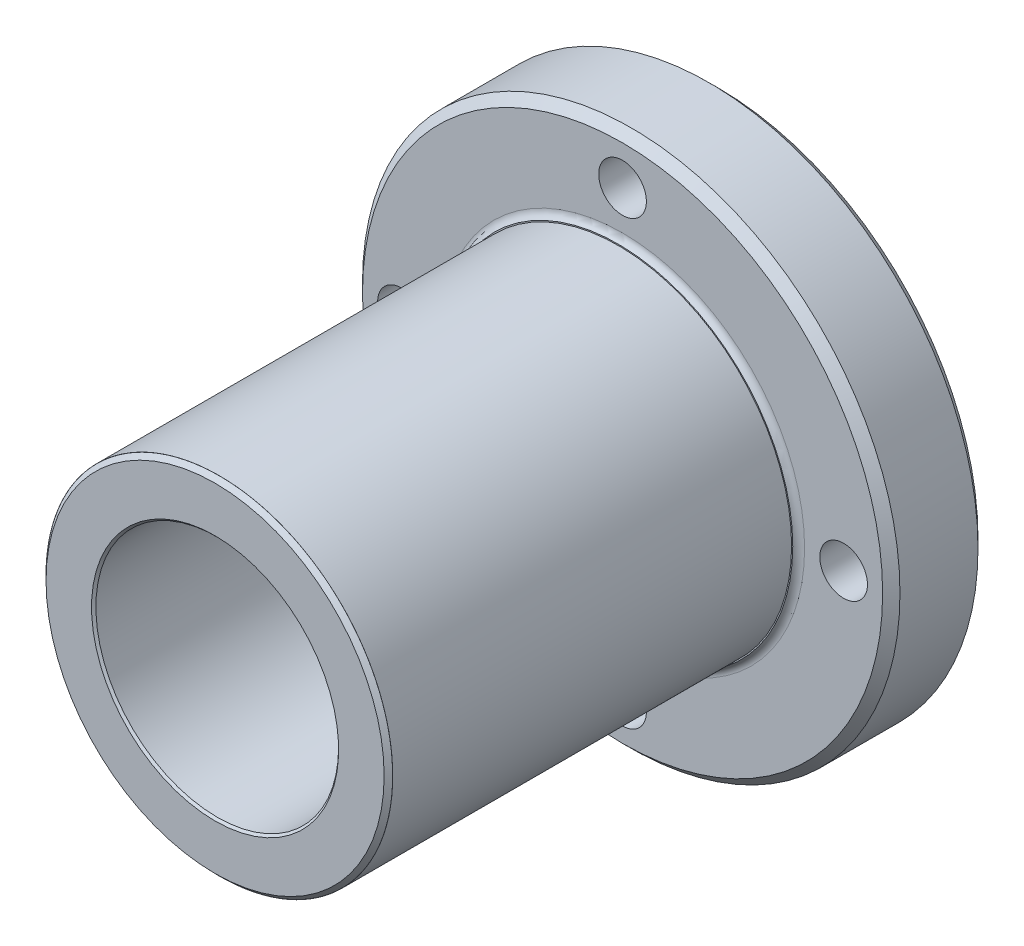
ISO-10303-21;
HEADER;
FILE_DESCRIPTION(('STEP AP214'),'2;1');
FILE_NAME('part.step','',(''),(''),'','','');
FILE_SCHEMA(('AUTOMOTIVE_DESIGN { 1 0 10303 214 1 1 1 1 }'));
ENDSEC;
DATA;
#1=APPLICATION_CONTEXT('core data for automotive mechanical design processes');
#2=APPLICATION_PROTOCOL_DEFINITION('international standard','automotive_design',2000,#1);
#3=PRODUCT_CONTEXT('',#1,'mechanical');
#4=PRODUCT('Part','Part','',(#3));
#5=PRODUCT_RELATED_PRODUCT_CATEGORY('part','',(#4));
#6=PRODUCT_DEFINITION_FORMATION('','',#4);
#7=PRODUCT_DEFINITION_CONTEXT('part definition',#1,'design');
#8=PRODUCT_DEFINITION('design','',#6,#7);
#9=PRODUCT_DEFINITION_SHAPE('','',#8);
#10=(LENGTH_UNIT() NAMED_UNIT(*) SI_UNIT(.MILLI.,.METRE.));
#11=(NAMED_UNIT(*) PLANE_ANGLE_UNIT() SI_UNIT($,.RADIAN.));
#12=(NAMED_UNIT(*) SI_UNIT($,.STERADIAN.) SOLID_ANGLE_UNIT());
#13=UNCERTAINTY_MEASURE_WITH_UNIT(LENGTH_MEASURE(1.E-05),#10,'distance_accuracy_value','');
#14=(GEOMETRIC_REPRESENTATION_CONTEXT(3) GLOBAL_UNCERTAINTY_ASSIGNED_CONTEXT((#13)) GLOBAL_UNIT_ASSIGNED_CONTEXT((#10,
#11,#12)) REPRESENTATION_CONTEXT('',''));
#15=CARTESIAN_POINT('',(0.,0.,0.));
#16=DIRECTION('',(0.,0.,1.));
#17=DIRECTION('',(1.,0.,0.));
#18=AXIS2_PLACEMENT_3D('',#15,#16,#17);
#19=CARTESIAN_POINT('',(0.,0.,-28.99));
#20=DIRECTION('',(0.,0.,1.));
#21=DIRECTION('',(1.,0.,0.));
#22=AXIS2_PLACEMENT_3D('',#19,#20,#21);
#23=PLANE('',#22);
#24=CARTESIAN_POINT('',(0.,0.,-28.99));
#25=DIRECTION('',(0.,0.,1.));
#26=DIRECTION('',(0.,-1.,0.));
#27=AXIS2_PLACEMENT_3D('',#24,#25,#26);
#28=CIRCLE('',#27,30.01);
#29=CARTESIAN_POINT('',(0.,-30.01,-28.99));
#30=VERTEX_POINT('',#29);
#31=EDGE_CURVE('E149',#30,#30,#28,.T.);
#32=ORIENTED_EDGE('',*,*,#31,.F.);
#33=EDGE_LOOP('',(#32));
#34=FACE_BOUND('',#33,.T.);
#35=CARTESIAN_POINT('',(25.5,0.,-28.99));
#36=DIRECTION('',(0.,0.,1.));
#37=DIRECTION('',(1.,0.,0.));
#38=AXIS2_PLACEMENT_3D('',#35,#36,#37);
#39=CIRCLE('',#38,4.5);
#40=CARTESIAN_POINT('',(30.,0.,-28.99));
#41=VERTEX_POINT('',#40);
#42=EDGE_CURVE('E152',#41,#41,#39,.T.);
#43=ORIENTED_EDGE('',*,*,#42,.T.);
#44=EDGE_LOOP('',(#43));
#45=FACE_BOUND('',#44,.T.);
#46=CARTESIAN_POINT('',(0.,25.5,-28.99));
#47=DIRECTION('',(0.,0.,1.));
#48=DIRECTION('',(1.,0.,0.));
#49=AXIS2_PLACEMENT_3D('',#46,#47,#48);
#50=CIRCLE('',#49,4.5);
#51=CARTESIAN_POINT('',(4.5,25.5,-28.99));
#52=VERTEX_POINT('',#51);
#53=EDGE_CURVE('E155',#52,#52,#50,.T.);
#54=ORIENTED_EDGE('',*,*,#53,.T.);
#55=EDGE_LOOP('',(#54));
#56=FACE_BOUND('',#55,.T.);
#57=CARTESIAN_POINT('',(-25.5,0.,-28.99));
#58=DIRECTION('',(0.,0.,1.));
#59=DIRECTION('',(1.,0.,0.));
#60=AXIS2_PLACEMENT_3D('',#57,#58,#59);
#61=CIRCLE('',#60,4.5);
#62=CARTESIAN_POINT('',(-21.,0.,-28.99));
#63=VERTEX_POINT('',#62);
#64=EDGE_CURVE('E158',#63,#63,#61,.T.);
#65=ORIENTED_EDGE('',*,*,#64,.T.);
#66=EDGE_LOOP('',(#65));
#67=FACE_BOUND('',#66,.T.);
#68=CARTESIAN_POINT('',(0.,-25.5,-28.99));
#69=DIRECTION('',(0.,0.,1.));
#70=DIRECTION('',(1.,0.,0.));
#71=AXIS2_PLACEMENT_3D('',#68,#69,#70);
#72=CIRCLE('',#71,4.5);
#73=CARTESIAN_POINT('',(4.5,-25.5,-28.99));
#74=VERTEX_POINT('',#73);
#75=EDGE_CURVE('E161',#74,#74,#72,.T.);
#76=ORIENTED_EDGE('',*,*,#75,.T.);
#77=EDGE_LOOP('',(#76));
#78=FACE_BOUND('',#77,.T.);
#79=CARTESIAN_POINT('',(0.,0.,-28.99));
#80=DIRECTION('',(0.,0.,-1.));
#81=DIRECTION('',(0.,1.,0.));
#82=AXIS2_PLACEMENT_3D('',#79,#80,#81);
#83=CIRCLE('',#82,14.25);
#84=CARTESIAN_POINT('',(0.,14.25,-28.99));
#85=VERTEX_POINT('',#84);
#86=EDGE_CURVE('E146',#85,#85,#83,.F.);
#87=ORIENTED_EDGE('',*,*,#86,.T.);
#88=EDGE_LOOP('',(#87));
#89=FACE_BOUND('',#88,.T.);
#90=ADVANCED_FACE('F17',(#34,#45,#56,#67,#78,#89),#23,.F.);
#91=CARTESIAN_POINT('',(0.,-25.5,-26.45));
#92=DIRECTION('',(0.,0.,1.));
#93=DIRECTION('',(1.,0.,0.));
#94=AXIS2_PLACEMENT_3D('',#91,#92,#93);
#95=CYLINDRICAL_SURFACE('',#94,4.5);
#96=CARTESIAN_POINT('',(0.,-25.5,-23.9));
#97=DIRECTION('',(0.,0.,1.));
#98=DIRECTION('',(1.,0.,0.));
#99=AXIS2_PLACEMENT_3D('',#96,#97,#98);
#100=CIRCLE('',#99,4.5);
#101=CARTESIAN_POINT('',(4.5,-25.5,-23.9));
#102=VERTEX_POINT('',#101);
#103=EDGE_CURVE('E143',#102,#102,#100,.T.);
#104=ORIENTED_EDGE('',*,*,#103,.T.);
#105=EDGE_LOOP('',(#104));
#106=FACE_BOUND('',#105,.T.);
#107=ORIENTED_EDGE('',*,*,#75,.F.);
#108=EDGE_LOOP('',(#107));
#109=FACE_BOUND('',#108,.T.);
#110=ADVANCED_FACE('F167',(#106,#109),#95,.F.);
#111=CARTESIAN_POINT('',(-25.5,0.,-26.45));
#112=DIRECTION('',(0.,0.,1.));
#113=DIRECTION('',(1.,0.,0.));
#114=AXIS2_PLACEMENT_3D('',#111,#112,#113);
#115=CYLINDRICAL_SURFACE('',#114,4.5);
#116=CARTESIAN_POINT('',(-25.5,0.,-23.9));
#117=DIRECTION('',(0.,0.,1.));
#118=DIRECTION('',(1.,0.,0.));
#119=AXIS2_PLACEMENT_3D('',#116,#117,#118);
#120=CIRCLE('',#119,4.5);
#121=CARTESIAN_POINT('',(-21.,0.,-23.9));
#122=VERTEX_POINT('',#121);
#123=EDGE_CURVE('E140',#122,#122,#120,.T.);
#124=ORIENTED_EDGE('',*,*,#123,.T.);
#125=EDGE_LOOP('',(#124));
#126=FACE_BOUND('',#125,.T.);
#127=ORIENTED_EDGE('',*,*,#64,.F.);
#128=EDGE_LOOP('',(#127));
#129=FACE_BOUND('',#128,.T.);
#130=ADVANCED_FACE('F169',(#126,#129),#115,.F.);
#131=CARTESIAN_POINT('',(0.,25.5,-26.45));
#132=DIRECTION('',(0.,0.,1.));
#133=DIRECTION('',(1.,0.,0.));
#134=AXIS2_PLACEMENT_3D('',#131,#132,#133);
#135=CYLINDRICAL_SURFACE('',#134,4.5);
#136=CARTESIAN_POINT('',(0.,25.5,-23.9));
#137=DIRECTION('',(0.,0.,1.));
#138=DIRECTION('',(1.,0.,0.));
#139=AXIS2_PLACEMENT_3D('',#136,#137,#138);
#140=CIRCLE('',#139,4.5);
#141=CARTESIAN_POINT('',(4.5,25.5,-23.9));
#142=VERTEX_POINT('',#141);
#143=EDGE_CURVE('E137',#142,#142,#140,.T.);
#144=ORIENTED_EDGE('',*,*,#143,.T.);
#145=EDGE_LOOP('',(#144));
#146=FACE_BOUND('',#145,.T.);
#147=ORIENTED_EDGE('',*,*,#53,.F.);
#148=EDGE_LOOP('',(#147));
#149=FACE_BOUND('',#148,.T.);
#150=ADVANCED_FACE('F176',(#146,#149),#135,.F.);
#151=CARTESIAN_POINT('',(25.5,0.,-26.45));
#152=DIRECTION('',(0.,0.,1.));
#153=DIRECTION('',(1.,0.,0.));
#154=AXIS2_PLACEMENT_3D('',#151,#152,#153);
#155=CYLINDRICAL_SURFACE('',#154,4.5);
#156=CARTESIAN_POINT('',(25.5,0.,-23.9));
#157=DIRECTION('',(0.,0.,1.));
#158=DIRECTION('',(1.,0.,0.));
#159=AXIS2_PLACEMENT_3D('',#156,#157,#158);
#160=CIRCLE('',#159,4.5);
#161=CARTESIAN_POINT('',(30.,0.,-23.9));
#162=VERTEX_POINT('',#161);
#163=EDGE_CURVE('E133',#162,#162,#160,.T.);
#164=ORIENTED_EDGE('',*,*,#163,.T.);
#165=EDGE_LOOP('',(#164));
#166=FACE_BOUND('',#165,.T.);
#167=ORIENTED_EDGE('',*,*,#42,.F.);
#168=EDGE_LOOP('',(#167));
#169=FACE_BOUND('',#168,.T.);
#170=ADVANCED_FACE('F287',(#166,#169),#155,.F.);
#171=CARTESIAN_POINT('',(0.,0.,-28.));
#172=DIRECTION('',(0.,0.,1.));
#173=DIRECTION('',(0.,-1.,0.));
#174=AXIS2_PLACEMENT_3D('',#171,#172,#173);
#175=CONICAL_SURFACE('',#174,31.,0.785398163397447);
#176=ORIENTED_EDGE('',*,*,#31,.T.);
#177=EDGE_LOOP('',(#176));
#178=FACE_BOUND('',#177,.T.);
#179=CARTESIAN_POINT('',(0.,0.,-28.));
#180=DIRECTION('',(0.,0.,1.));
#181=DIRECTION('',(1.,0.,0.));
#182=AXIS2_PLACEMENT_3D('',#179,#180,#181);
#183=CIRCLE('',#182,31.);
#184=CARTESIAN_POINT('',(31.,0.,-28.));
#185=VERTEX_POINT('',#184);
#186=EDGE_CURVE('E136',#185,#185,#183,.T.);
#187=ORIENTED_EDGE('',*,*,#186,.F.);
#188=EDGE_LOOP('',(#187));
#189=FACE_BOUND('',#188,.T.);
#190=ADVANCED_FACE('F283',(#178,#189),#175,.T.);
#191=CARTESIAN_POINT('',(0.,0.,-28.99));
#192=DIRECTION('',(0.,0.,-1.));
#193=DIRECTION('',(0.,1.,0.));
#194=AXIS2_PLACEMENT_3D('',#191,#192,#193);
#195=CONICAL_SURFACE('',#194,14.25,0.785398163397448);
#196=ORIENTED_EDGE('',*,*,#86,.F.);
#197=EDGE_LOOP('',(#196));
#198=FACE_BOUND('',#197,.T.);
#199=CARTESIAN_POINT('',(0.,0.,-28.74));
#200=DIRECTION('',(0.,0.,1.));
#201=DIRECTION('',(1.,0.,0.));
#202=AXIS2_PLACEMENT_3D('',#199,#200,#201);
#203=CIRCLE('',#202,14.);
#204=CARTESIAN_POINT('',(14.,0.,-28.74));
#205=VERTEX_POINT('',#204);
#206=EDGE_CURVE('E132',#205,#205,#203,.T.);
#207=ORIENTED_EDGE('',*,*,#206,.T.);
#208=EDGE_LOOP('',(#207));
#209=FACE_BOUND('',#208,.T.);
#210=ADVANCED_FACE('F279',(#198,#209),#195,.F.);
#211=CARTESIAN_POINT('',(0.,-25.5,-23.9));
#212=DIRECTION('',(0.,0.,1.));
#213=DIRECTION('',(1.,0.,0.));
#214=AXIS2_PLACEMENT_3D('',#211,#212,#213);
#215=PLANE('',#214);
#216=ORIENTED_EDGE('',*,*,#103,.F.);
#217=EDGE_LOOP('',(#216));
#218=FACE_BOUND('',#217,.T.);
#219=CARTESIAN_POINT('',(0.,-25.5,-23.9));
#220=DIRECTION('',(0.,0.,1.));
#221=DIRECTION('',(1.,0.,0.));
#222=AXIS2_PLACEMENT_3D('',#219,#220,#221);
#223=CIRCLE('',#222,2.75);
#224=CARTESIAN_POINT('',(2.75,-25.5,-23.9));
#225=VERTEX_POINT('',#224);
#226=EDGE_CURVE('E129',#225,#225,#223,.T.);
#227=ORIENTED_EDGE('',*,*,#226,.T.);
#228=EDGE_LOOP('',(#227));
#229=FACE_BOUND('',#228,.T.);
#230=ADVANCED_FACE('F275',(#218,#229),#215,.F.);
#231=CARTESIAN_POINT('',(-25.5,0.,-23.9));
#232=DIRECTION('',(0.,0.,1.));
#233=DIRECTION('',(1.,0.,0.));
#234=AXIS2_PLACEMENT_3D('',#231,#232,#233);
#235=PLANE('',#234);
#236=ORIENTED_EDGE('',*,*,#123,.F.);
#237=EDGE_LOOP('',(#236));
#238=FACE_BOUND('',#237,.T.);
#239=CARTESIAN_POINT('',(-25.5,0.,-23.9));
#240=DIRECTION('',(0.,0.,1.));
#241=DIRECTION('',(1.,0.,0.));
#242=AXIS2_PLACEMENT_3D('',#239,#240,#241);
#243=CIRCLE('',#242,2.75);
#244=CARTESIAN_POINT('',(-22.75,0.,-23.9));
#245=VERTEX_POINT('',#244);
#246=EDGE_CURVE('E126',#245,#245,#243,.T.);
#247=ORIENTED_EDGE('',*,*,#246,.T.);
#248=EDGE_LOOP('',(#247));
#249=FACE_BOUND('',#248,.T.);
#250=ADVANCED_FACE('F271',(#238,#249),#235,.F.);
#251=CARTESIAN_POINT('',(0.,25.5,-23.9));
#252=DIRECTION('',(0.,0.,1.));
#253=DIRECTION('',(1.,0.,0.));
#254=AXIS2_PLACEMENT_3D('',#251,#252,#253);
#255=PLANE('',#254);
#256=ORIENTED_EDGE('',*,*,#143,.F.);
#257=EDGE_LOOP('',(#256));
#258=FACE_BOUND('',#257,.T.);
#259=CARTESIAN_POINT('',(0.,25.5,-23.9));
#260=DIRECTION('',(0.,0.,1.));
#261=DIRECTION('',(1.,0.,0.));
#262=AXIS2_PLACEMENT_3D('',#259,#260,#261);
#263=CIRCLE('',#262,2.75);
#264=CARTESIAN_POINT('',(2.75,25.5,-23.9));
#265=VERTEX_POINT('',#264);
#266=EDGE_CURVE('E123',#265,#265,#263,.T.);
#267=ORIENTED_EDGE('',*,*,#266,.T.);
#268=EDGE_LOOP('',(#267));
#269=FACE_BOUND('',#268,.T.);
#270=ADVANCED_FACE('F267',(#258,#269),#255,.F.);
#271=CARTESIAN_POINT('',(25.5,0.,-23.9));
#272=DIRECTION('',(0.,0.,1.));
#273=DIRECTION('',(1.,0.,0.));
#274=AXIS2_PLACEMENT_3D('',#271,#272,#273);
#275=PLANE('',#274);
#276=ORIENTED_EDGE('',*,*,#163,.F.);
#277=EDGE_LOOP('',(#276));
#278=FACE_BOUND('',#277,.T.);
#279=CARTESIAN_POINT('',(25.5,0.,-23.9));
#280=DIRECTION('',(0.,0.,1.));
#281=DIRECTION('',(1.,0.,0.));
#282=AXIS2_PLACEMENT_3D('',#279,#280,#281);
#283=CIRCLE('',#282,2.75);
#284=CARTESIAN_POINT('',(28.25,0.,-23.9));
#285=VERTEX_POINT('',#284);
#286=EDGE_CURVE('E120',#285,#285,#283,.T.);
#287=ORIENTED_EDGE('',*,*,#286,.T.);
#288=EDGE_LOOP('',(#287));
#289=FACE_BOUND('',#288,.T.);
#290=ADVANCED_FACE('F263',(#278,#289),#275,.F.);
#291=CARTESIAN_POINT('',(0.,0.,-23.5));
#292=DIRECTION('',(0.,0.,1.));
#293=DIRECTION('',(1.,0.,0.));
#294=AXIS2_PLACEMENT_3D('',#291,#292,#293);
#295=CYLINDRICAL_SURFACE('',#294,31.);
#296=ORIENTED_EDGE('',*,*,#186,.T.);
#297=EDGE_LOOP('',(#296));
#298=FACE_BOUND('',#297,.T.);
#299=CARTESIAN_POINT('',(0.,0.,-19.));
#300=DIRECTION('',(0.,0.,-1.));
#301=DIRECTION('',(1.,0.,0.));
#302=AXIS2_PLACEMENT_3D('',#299,#300,#301);
#303=CIRCLE('',#302,31.);
#304=CARTESIAN_POINT('',(31.,0.,-19.));
#305=VERTEX_POINT('',#304);
#306=EDGE_CURVE('E119',#305,#305,#303,.F.);
#307=ORIENTED_EDGE('',*,*,#306,.F.);
#308=EDGE_LOOP('',(#307));
#309=FACE_BOUND('',#308,.T.);
#310=ADVANCED_FACE('F259',(#298,#309),#295,.T.);
#311=CARTESIAN_POINT('',(0.,0.,14.51));
#312=DIRECTION('',(0.,0.,1.));
#313=DIRECTION('',(1.,0.,0.));
#314=AXIS2_PLACEMENT_3D('',#311,#312,#313);
#315=CYLINDRICAL_SURFACE('',#314,14.);
#316=ORIENTED_EDGE('',*,*,#206,.F.);
#317=EDGE_LOOP('',(#316));
#318=FACE_BOUND('',#317,.T.);
#319=CARTESIAN_POINT('',(0.,0.,-2.5));
#320=DIRECTION('',(0.,0.,1.));
#321=DIRECTION('',(1.,0.,0.));
#322=AXIS2_PLACEMENT_3D('',#319,#320,#321);
#323=CIRCLE('',#322,14.);
#324=CARTESIAN_POINT('',(14.,0.,-2.5));
#325=VERTEX_POINT('',#324);
#326=EDGE_CURVE('E113',#325,#325,#323,.T.);
#327=ORIENTED_EDGE('',*,*,#326,.T.);
#328=EDGE_LOOP('',(#327));
#329=FACE_BOUND('',#328,.T.);
#330=ADVANCED_FACE('F255',(#318,#329),#315,.F.);
#331=CARTESIAN_POINT('',(0.,0.,14.51));
#332=DIRECTION('',(0.,0.,1.));
#333=DIRECTION('',(1.,0.,0.));
#334=AXIS2_PLACEMENT_3D('',#331,#332,#333);
#335=CYLINDRICAL_SURFACE('',#334,14.);
#336=CARTESIAN_POINT('',(0.,0.,2.5));
#337=DIRECTION('',(0.,0.,1.));
#338=DIRECTION('',(1.,0.,0.));
#339=AXIS2_PLACEMENT_3D('',#336,#337,#338);
#340=CIRCLE('',#339,14.);
#341=CARTESIAN_POINT('',(14.,0.,2.5));
#342=VERTEX_POINT('',#341);
#343=EDGE_CURVE('E116',#342,#342,#340,.F.);
#344=ORIENTED_EDGE('',*,*,#343,.T.);
#345=EDGE_LOOP('',(#344));
#346=FACE_BOUND('',#345,.T.);
#347=CARTESIAN_POINT('',(0.,0.,28.75));
#348=DIRECTION('',(0.,0.,1.));
#349=DIRECTION('',(1.,0.,0.));
#350=AXIS2_PLACEMENT_3D('',#347,#348,#349);
#351=CIRCLE('',#350,14.);
#352=CARTESIAN_POINT('',(14.,0.,28.75));
#353=VERTEX_POINT('',#352);
#354=EDGE_CURVE('E56',#353,#353,#351,.T.);
#355=ORIENTED_EDGE('',*,*,#354,.T.);
#356=EDGE_LOOP('',(#355));
#357=FACE_BOUND('',#356,.T.);
#358=ADVANCED_FACE('F251',(#346,#357),#335,.F.);
#359=CARTESIAN_POINT('',(0.,-25.5,-23.5));
#360=DIRECTION('',(0.,0.,1.));
#361=DIRECTION('',(1.,0.,0.));
#362=AXIS2_PLACEMENT_3D('',#359,#360,#361);
#363=CYLINDRICAL_SURFACE('',#362,2.75);
#364=ORIENTED_EDGE('',*,*,#226,.F.);
#365=EDGE_LOOP('',(#364));
#366=FACE_BOUND('',#365,.T.);
#367=CARTESIAN_POINT('',(0.,-25.5,-18.));
#368=DIRECTION('',(0.,0.,1.));
#369=DIRECTION('',(1.,0.,0.));
#370=AXIS2_PLACEMENT_3D('',#367,#368,#369);
#371=CIRCLE('',#370,2.75);
#372=CARTESIAN_POINT('',(2.75,-25.5,-18.));
#373=VERTEX_POINT('',#372);
#374=EDGE_CURVE('E110',#373,#373,#371,.T.);
#375=ORIENTED_EDGE('',*,*,#374,.T.);
#376=EDGE_LOOP('',(#375));
#377=FACE_BOUND('',#376,.T.);
#378=ADVANCED_FACE('F247',(#366,#377),#363,.F.);
#379=CARTESIAN_POINT('',(-25.5,0.,-23.5));
#380=DIRECTION('',(0.,0.,1.));
#381=DIRECTION('',(1.,0.,0.));
#382=AXIS2_PLACEMENT_3D('',#379,#380,#381);
#383=CYLINDRICAL_SURFACE('',#382,2.75);
#384=ORIENTED_EDGE('',*,*,#246,.F.);
#385=EDGE_LOOP('',(#384));
#386=FACE_BOUND('',#385,.T.);
#387=CARTESIAN_POINT('',(-25.5,0.,-18.));
#388=DIRECTION('',(0.,0.,1.));
#389=DIRECTION('',(1.,0.,0.));
#390=AXIS2_PLACEMENT_3D('',#387,#388,#389);
#391=CIRCLE('',#390,2.75);
#392=CARTESIAN_POINT('',(-22.75,0.,-18.));
#393=VERTEX_POINT('',#392);
#394=EDGE_CURVE('E107',#393,#393,#391,.T.);
#395=ORIENTED_EDGE('',*,*,#394,.T.);
#396=EDGE_LOOP('',(#395));
#397=FACE_BOUND('',#396,.T.);
#398=ADVANCED_FACE('F243',(#386,#397),#383,.F.);
#399=CARTESIAN_POINT('',(0.,25.5,-23.5));
#400=DIRECTION('',(0.,0.,1.));
#401=DIRECTION('',(1.,0.,0.));
#402=AXIS2_PLACEMENT_3D('',#399,#400,#401);
#403=CYLINDRICAL_SURFACE('',#402,2.75);
#404=ORIENTED_EDGE('',*,*,#266,.F.);
#405=EDGE_LOOP('',(#404));
#406=FACE_BOUND('',#405,.T.);
#407=CARTESIAN_POINT('',(0.,25.5,-18.));
#408=DIRECTION('',(0.,0.,1.));
#409=DIRECTION('',(1.,0.,0.));
#410=AXIS2_PLACEMENT_3D('',#407,#408,#409);
#411=CIRCLE('',#410,2.75);
#412=CARTESIAN_POINT('',(2.75,25.5,-18.));
#413=VERTEX_POINT('',#412);
#414=EDGE_CURVE('E104',#413,#413,#411,.T.);
#415=ORIENTED_EDGE('',*,*,#414,.T.);
#416=EDGE_LOOP('',(#415));
#417=FACE_BOUND('',#416,.T.);
#418=ADVANCED_FACE('F239',(#406,#417),#403,.F.);
#419=CARTESIAN_POINT('',(25.5,0.,-23.5));
#420=DIRECTION('',(0.,0.,1.));
#421=DIRECTION('',(1.,0.,0.));
#422=AXIS2_PLACEMENT_3D('',#419,#420,#421);
#423=CYLINDRICAL_SURFACE('',#422,2.75);
#424=ORIENTED_EDGE('',*,*,#286,.F.);
#425=EDGE_LOOP('',(#424));
#426=FACE_BOUND('',#425,.T.);
#427=CARTESIAN_POINT('',(25.5,0.,-18.));
#428=DIRECTION('',(0.,0.,1.));
#429=DIRECTION('',(1.,0.,0.));
#430=AXIS2_PLACEMENT_3D('',#427,#428,#429);
#431=CIRCLE('',#430,2.75);
#432=CARTESIAN_POINT('',(28.25,0.,-18.));
#433=VERTEX_POINT('',#432);
#434=EDGE_CURVE('E101',#433,#433,#431,.T.);
#435=ORIENTED_EDGE('',*,*,#434,.T.);
#436=EDGE_LOOP('',(#435));
#437=FACE_BOUND('',#436,.T.);
#438=ADVANCED_FACE('F235',(#426,#437),#423,.F.);
#439=CARTESIAN_POINT('',(0.,0.,-19.));
#440=DIRECTION('',(0.,0.,-1.));
#441=DIRECTION('',(-1.,0.,0.));
#442=AXIS2_PLACEMENT_3D('',#439,#440,#441);
#443=CONICAL_SURFACE('',#442,31.,0.785398163397448);
#444=ORIENTED_EDGE('',*,*,#306,.T.);
#445=EDGE_LOOP('',(#444));
#446=FACE_BOUND('',#445,.T.);
#447=CARTESIAN_POINT('',(0.,0.,-18.));
#448=DIRECTION('',(0.,0.,-1.));
#449=DIRECTION('',(-1.,0.,0.));
#450=AXIS2_PLACEMENT_3D('',#447,#448,#449);
#451=CIRCLE('',#450,30.);
#452=CARTESIAN_POINT('',(-30.,0.,-18.));
#453=VERTEX_POINT('',#452);
#454=EDGE_CURVE('E98',#453,#453,#451,.T.);
#455=ORIENTED_EDGE('',*,*,#454,.T.);
#456=EDGE_LOOP('',(#455));
#457=FACE_BOUND('',#456,.T.);
#458=ADVANCED_FACE('F231',(#446,#457),#443,.T.);
#459=CARTESIAN_POINT('',(0.,0.,2.5));
#460=DIRECTION('',(0.,0.,1.));
#461=DIRECTION('',(1.,0.,0.));
#462=AXIS2_PLACEMENT_3D('',#459,#460,#461);
#463=PLANE('',#462);
#464=CARTESIAN_POINT('',(0.,0.,2.5));
#465=DIRECTION('',(0.,0.,1.));
#466=DIRECTION('',(1.,0.,0.));
#467=AXIS2_PLACEMENT_3D('',#464,#465,#466);
#468=CIRCLE('',#467,14.8);
#469=CARTESIAN_POINT('',(14.8,0.,2.5));
#470=VERTEX_POINT('',#469);
#471=EDGE_CURVE('E95',#470,#470,#468,.F.);
#472=ORIENTED_EDGE('',*,*,#471,.T.);
#473=EDGE_LOOP('',(#472));
#474=FACE_BOUND('',#473,.T.);
#475=ORIENTED_EDGE('',*,*,#343,.F.);
#476=EDGE_LOOP('',(#475));
#477=FACE_BOUND('',#476,.T.);
#478=ADVANCED_FACE('F224',(#474,#477),#463,.F.);
#479=CARTESIAN_POINT('',(0.,0.,-2.5));
#480=DIRECTION('',(0.,0.,-1.));
#481=DIRECTION('',(-1.,0.,0.));
#482=AXIS2_PLACEMENT_3D('',#479,#480,#481);
#483=PLANE('',#482);
#484=CARTESIAN_POINT('',(0.,0.,-2.5));
#485=DIRECTION('',(0.,0.,1.));
#486=DIRECTION('',(1.,0.,0.));
#487=AXIS2_PLACEMENT_3D('',#484,#485,#486);
#488=CIRCLE('',#487,14.8);
#489=CARTESIAN_POINT('',(14.8,0.,-2.5));
#490=VERTEX_POINT('',#489);
#491=EDGE_CURVE('E92',#490,#490,#488,.T.);
#492=ORIENTED_EDGE('',*,*,#491,.T.);
#493=EDGE_LOOP('',(#492));
#494=FACE_BOUND('',#493,.T.);
#495=ORIENTED_EDGE('',*,*,#326,.F.);
#496=EDGE_LOOP('',(#495));
#497=FACE_BOUND('',#496,.T.);
#498=ADVANCED_FACE('F217',(#494,#497),#483,.F.);
#499=CARTESIAN_POINT('',(0.,0.,29.));
#500=DIRECTION('',(0.,0.,1.));
#501=DIRECTION('',(0.,-1.,0.));
#502=AXIS2_PLACEMENT_3D('',#499,#500,#501);
#503=CONICAL_SURFACE('',#502,14.25,0.785398163397448);
#504=ORIENTED_EDGE('',*,*,#354,.F.);
#505=EDGE_LOOP('',(#504));
#506=FACE_BOUND('',#505,.T.);
#507=CARTESIAN_POINT('',(0.,0.,29.));
#508=DIRECTION('',(0.,0.,1.));
#509=DIRECTION('',(0.,-1.,0.));
#510=AXIS2_PLACEMENT_3D('',#507,#508,#509);
#511=CIRCLE('',#510,14.25);
#512=CARTESIAN_POINT('',(0.,-14.25,29.));
#513=VERTEX_POINT('',#512);
#514=EDGE_CURVE('E41',#513,#513,#511,.T.);
#515=ORIENTED_EDGE('',*,*,#514,.T.);
#516=EDGE_LOOP('',(#515));
#517=FACE_BOUND('',#516,.T.);
#518=ADVANCED_FACE('F215',(#506,#517),#503,.F.);
#519=CARTESIAN_POINT('',(0.,0.,-18.));
#520=DIRECTION('',(0.,0.,-1.));
#521=DIRECTION('',(-1.,0.,0.));
#522=AXIS2_PLACEMENT_3D('',#519,#520,#521);
#523=PLANE('',#522);
#524=ORIENTED_EDGE('',*,*,#454,.F.);
#525=EDGE_LOOP('',(#524));
#526=FACE_BOUND('',#525,.T.);
#527=ORIENTED_EDGE('',*,*,#434,.F.);
#528=EDGE_LOOP('',(#527));
#529=FACE_BOUND('',#528,.T.);
#530=ORIENTED_EDGE('',*,*,#414,.F.);
#531=EDGE_LOOP('',(#530));
#532=FACE_BOUND('',#531,.T.);
#533=ORIENTED_EDGE('',*,*,#394,.F.);
#534=EDGE_LOOP('',(#533));
#535=FACE_BOUND('',#534,.T.);
#536=ORIENTED_EDGE('',*,*,#374,.F.);
#537=EDGE_LOOP('',(#536));
#538=FACE_BOUND('',#537,.T.);
#539=CARTESIAN_POINT('',(0.,0.,-18.));
#540=DIRECTION('',(0.,0.,1.));
#541=DIRECTION('',(-1.,0.,0.));
#542=AXIS2_PLACEMENT_3D('',#539,#540,#541);
#543=CIRCLE('',#542,21.);
#544=CARTESIAN_POINT('',(21.,0.,-18.));
#545=VERTEX_POINT('',#544);
#546=CARTESIAN_POINT('',(-21.,0.,-18.));
#547=VERTEX_POINT('',#546);
#548=EDGE_CURVE('E37',#545,#547,#543,.F.);
#549=ORIENTED_EDGE('',*,*,#548,.T.);
#550=CARTESIAN_POINT('',(0.,0.,-18.));
#551=DIRECTION('',(0.,0.,1.));
#552=DIRECTION('',(1.,0.,0.));
#553=AXIS2_PLACEMENT_3D('',#550,#551,#552);
#554=CIRCLE('',#553,21.);
#555=EDGE_CURVE('E34',#547,#545,#554,.F.);
#556=ORIENTED_EDGE('',*,*,#555,.T.);
#557=EDGE_LOOP('',(#549,#556));
#558=FACE_BOUND('',#557,.T.);
#559=ADVANCED_FACE('F39',(#526,#529,#532,#535,#538,#558),#523,.F.);
#560=CARTESIAN_POINT('',(0.,0.,0.));
#561=DIRECTION('',(0.,0.,1.));
#562=DIRECTION('',(1.,0.,0.));
#563=AXIS2_PLACEMENT_3D('',#560,#561,#562);
#564=CYLINDRICAL_SURFACE('',#563,14.8);
#565=ORIENTED_EDGE('',*,*,#491,.F.);
#566=EDGE_LOOP('',(#565));
#567=FACE_BOUND('',#566,.T.);
#568=CARTESIAN_POINT('',(2.,-14.6642422238587,0.));
#569=CARTESIAN_POINT('',(1.99999502697603,-14.664243977992,0.111685397986144));
#570=CARTESIAN_POINT('',(1.99060564217841,-14.6655329570229,0.223516310472716));
#571=CARTESIAN_POINT('',(1.9532802267121,-14.6705500159504,0.444139583336799));
#572=CARTESIAN_POINT('',(1.92530581415448,-14.674283143282,0.552925168944273));
#573=CARTESIAN_POINT('',(1.85165160746117,-14.6837582194331,0.764114188634224));
#574=CARTESIAN_POINT('',(1.80599155878306,-14.6894979272747,0.866524592920172));
#575=CARTESIAN_POINT('',(1.69830337210463,-14.7023362626598,1.0621840516775));
#576=CARTESIAN_POINT('',(1.63628187105767,-14.7094343388671,1.15543679991228));
#577=CARTESIAN_POINT('',(1.49718622500393,-14.7242432719081,1.33080094244283));
#578=CARTESIAN_POINT('',(1.42002506272147,-14.7319575105676,1.41284304396537));
#579=CARTESIAN_POINT('',(1.25302457002495,-14.7470995583051,1.56285950520292));
#580=CARTESIAN_POINT('',(1.16318394872685,-14.7545273381208,1.63083243080793));
#581=CARTESIAN_POINT('',(0.972947981108539,-14.7682933334338,1.75102217234388));
#582=CARTESIAN_POINT('',(0.872513251341285,-14.774627234775,1.8031771886243));
#583=CARTESIAN_POINT('',(0.664211139721313,-14.7854552777885,1.88985383562431));
#584=CARTESIAN_POINT('',(0.556344143530069,-14.7899495148373,1.92437638051476));
#585=CARTESIAN_POINT('',(0.336937481139331,-14.796568503707,1.974604052196));
#586=CARTESIAN_POINT('',(0.225424262205926,-14.7987075561899,1.990422792181));
#587=CARTESIAN_POINT('',(0.00130677557033954,-14.800424070209,2.00314616760973));
#588=CARTESIAN_POINT('',(-0.111297444058746,-14.8000016441045,2.00005163268465));
#589=CARTESIAN_POINT('',(-0.333625479704704,-14.7966543164906,1.97512686811688));
#590=CARTESIAN_POINT('',(-0.4433632952617,-14.7937457600214,1.95341900867872));
#591=CARTESIAN_POINT('',(-0.65762504191252,-14.7857712185074,1.89207506639911));
#592=CARTESIAN_POINT('',(-0.762148814749447,-14.7807051680228,1.85243843974996));
#593=CARTESIAN_POINT('',(-0.963393283684682,-14.7689564990498,1.75623231188814));
#594=CARTESIAN_POINT('',(-1.06008835387569,-14.7622688369398,1.69960984751592));
#595=CARTESIAN_POINT('',(-1.24264258395931,-14.7480247948767,1.57108277453092));
#596=CARTESIAN_POINT('',(-1.32850203088241,-14.7404684379449,1.49917857085959));
#597=CARTESIAN_POINT('',(-1.48766131506056,-14.7252612256727,1.34145952164206));
#598=CARTESIAN_POINT('',(-1.56085798049676,-14.717610092945,1.25554056322273));
#599=CARTESIAN_POINT('',(-1.69184207419054,-14.7031299108174,1.0725364014677));
#600=CARTESIAN_POINT('',(-1.74962246904387,-14.696301237427,0.975446130228411));
#601=CARTESIAN_POINT('',(-1.84813715213195,-14.6842386783276,0.772731708114039));
#602=CARTESIAN_POINT('',(-1.88884816427063,-14.6790069728962,0.667096137220656));
#603=CARTESIAN_POINT('',(-1.95183966772995,-14.6707650348224,0.450542949111311));
#604=CARTESIAN_POINT('',(-1.97415917440213,-14.6677501010394,0.339637044031103));
#605=CARTESIAN_POINT('',(-1.99132295033895,-14.6654233471142,0.189967917269286));
#606=CARTESIAN_POINT('',(-1.99457434769466,-14.6649813547853,0.152053294869656));
#607=CARTESIAN_POINT('',(-1.99891372038865,-14.6643904942145,0.0760980804849787));
#608=CARTESIAN_POINT('',(-2.0000016945886,-14.6642416261269,0.0380574884336613));
#609=CARTESIAN_POINT('',(-1.99999502697603,-14.664243977992,-0.111685397986144));
#610=CARTESIAN_POINT('',(-1.99060564217841,-14.6655329570229,-0.223516310472716));
#611=CARTESIAN_POINT('',(-1.9532802267121,-14.6705500159504,-0.444139583336799));
#612=CARTESIAN_POINT('',(-1.92530581415448,-14.674283143282,-0.552925168944273));
#613=CARTESIAN_POINT('',(-1.85165160746117,-14.6837582194331,-0.764114188634224));
#614=CARTESIAN_POINT('',(-1.80599155878306,-14.6894979272747,-0.866524592920172));
#615=CARTESIAN_POINT('',(-1.69830337210463,-14.7023362626598,-1.0621840516775));
#616=CARTESIAN_POINT('',(-1.63628187105767,-14.7094343388671,-1.15543679991228));
#617=CARTESIAN_POINT('',(-1.49718622500393,-14.7242432719081,-1.33080094244283));
#618=CARTESIAN_POINT('',(-1.42002506272147,-14.7319575105676,-1.41284304396537));
#619=CARTESIAN_POINT('',(-1.25302457002495,-14.7470995583051,-1.56285950520292));
#620=CARTESIAN_POINT('',(-1.16318394872685,-14.7545273381208,-1.63083243080793));
#621=CARTESIAN_POINT('',(-0.972947981108539,-14.7682933334338,-1.75102217234388));
#622=CARTESIAN_POINT('',(-0.872513251341285,-14.774627234775,-1.8031771886243));
#623=CARTESIAN_POINT('',(-0.664211139721313,-14.7854552777885,-1.88985383562431));
#624=CARTESIAN_POINT('',(-0.556344143530069,-14.7899495148373,-1.92437638051476));
#625=CARTESIAN_POINT('',(-0.336937481139331,-14.796568503707,-1.974604052196));
#626=CARTESIAN_POINT('',(-0.225424262205926,-14.7987075561899,-1.990422792181));
#627=CARTESIAN_POINT('',(-0.00130677557033958,-14.800424070209,-2.00314616760973));
#628=CARTESIAN_POINT('',(0.111297444058746,-14.8000016441045,-2.00005163268465));
#629=CARTESIAN_POINT('',(0.333625479704704,-14.7966543164906,-1.97512686811688));
#630=CARTESIAN_POINT('',(0.443363295261699,-14.7937457600214,-1.95341900867872));
#631=CARTESIAN_POINT('',(0.657625041912519,-14.7857712185074,-1.89207506639911));
#632=CARTESIAN_POINT('',(0.762148814749446,-14.7807051680228,-1.85243843974996));
#633=CARTESIAN_POINT('',(0.963393283684682,-14.7689564990498,-1.75623231188814));
#634=CARTESIAN_POINT('',(1.06008835387569,-14.7622688369398,-1.69960984751592));
#635=CARTESIAN_POINT('',(1.24264258395931,-14.7480247948767,-1.57108277453092));
#636=CARTESIAN_POINT('',(1.32850203088241,-14.7404684379449,-1.49917857085959));
#637=CARTESIAN_POINT('',(1.48766131506056,-14.7252612256727,-1.34145952164206));
#638=CARTESIAN_POINT('',(1.56085798049676,-14.717610092945,-1.25554056322273));
#639=CARTESIAN_POINT('',(1.69184207419054,-14.7031299108174,-1.0725364014677));
#640=CARTESIAN_POINT('',(1.74962246904387,-14.696301237427,-0.975446130228411));
#641=CARTESIAN_POINT('',(1.84813715213195,-14.6842386783276,-0.772731708114039));
#642=CARTESIAN_POINT('',(1.88884816427063,-14.6790069728962,-0.667096137220655));
#643=CARTESIAN_POINT('',(1.95183966772995,-14.6707650348224,-0.45054294911131));
#644=CARTESIAN_POINT('',(1.97415917440213,-14.6677501010394,-0.339637044031102));
#645=CARTESIAN_POINT('',(1.99132295033895,-14.6654233471142,-0.189967917269286));
#646=CARTESIAN_POINT('',(1.99457434769466,-14.6649813547853,-0.152053294869656));
#647=CARTESIAN_POINT('',(1.99891372038865,-14.6643904942145,-0.0760980804849787));
#648=CARTESIAN_POINT('',(2.0000016945886,-14.6642416261269,-0.0380574884336613));
#649=CARTESIAN_POINT('',(2.,-14.6642422238587,0.));
#650=B_SPLINE_CURVE_WITH_KNOTS('',3,(#568,#569,#570,#571,#572,#573,#574,#575,#576,#577,#578,
#579,#580,#581,#582,#583,#584,#585,#586,#587,#588,#589,#590,#591,#592,#593,#594,#595,#596,#597,
#598,#599,#600,#601,#602,#603,#604,#605,#606,#607,#608,#609,#610,#611,#612,#613,#614,#615,#616,
#617,#618,#619,#620,#621,#622,#623,#624,#625,#626,#627,#628,#629,#630,#631,#632,#633,#634,#635,
#636,#637,#638,#639,#640,#641,#642,#643,#644,#645,#646,#647,#648,#649),.UNSPECIFIED.,.T.,.F.,(4,
2,2,2,2,2,2,2,2,2,2,2,2,2,2,2,2,2,2,2,2,2,2,2,2,2,2,2,2,2,2,2,2,2,2,2,2,2,2,2,4),(0.,
0.334911080229309,0.670515979482022,1.00574726144036,1.34084276680528,1.67792389240543,
2.01503936071365,2.35345543829006,2.69185396860849,3.02818621631887,3.36450371091429,
3.6986269480006,4.03276032025002,4.36794657110965,4.70312394118104,5.0409152889903,
5.37886048569453,5.71726502307013,6.05494981448252,6.16907277133785,6.28319578824031,
6.61810686846962,6.95371176772234,7.28894304968067,7.62403855504559,7.96111968064575,
8.29823514895396,8.63665122653038,8.9750497568488,9.31138200455919,9.6476994991546,
9.98182273624091,10.3159561084903,10.65114235935,10.9863197294214,11.3241110772306,
11.6620562739348,12.0004608113104,12.3381456027228,12.4522685595782,12.5663915764806),.UNSPECIFIED.);
#651=CARTESIAN_POINT('',(2.,-14.6642422238587,0.));
#652=VERTEX_POINT('',#651);
#653=EDGE_CURVE('E47',#652,#652,#650,.T.);
#654=ORIENTED_EDGE('',*,*,#653,.T.);
#655=EDGE_LOOP('',(#654));
#656=FACE_BOUND('',#655,.T.);
#657=ORIENTED_EDGE('',*,*,#471,.F.);
#658=EDGE_LOOP('',(#657));
#659=FACE_BOUND('',#658,.T.);
#660=ADVANCED_FACE('F75',(#567,#656,#659),#564,.F.);
#661=CARTESIAN_POINT('',(0.,0.,29.));
#662=DIRECTION('',(0.,0.,-1.));
#663=DIRECTION('',(-1.,0.,0.));
#664=AXIS2_PLACEMENT_3D('',#661,#662,#663);
#665=PLANE('',#664);
#666=CARTESIAN_POINT('',(0.,0.,29.));
#667=DIRECTION('',(0.,0.,-1.));
#668=DIRECTION('',(-1.,0.,0.));
#669=AXIS2_PLACEMENT_3D('',#666,#667,#668);
#670=CIRCLE('',#669,19.5);
#671=CARTESIAN_POINT('',(-19.5,0.,29.));
#672=VERTEX_POINT('',#671);
#673=EDGE_CURVE('E88',#672,#672,#670,.T.);
#674=ORIENTED_EDGE('',*,*,#673,.F.);
#675=EDGE_LOOP('',(#674));
#676=FACE_BOUND('',#675,.T.);
#677=ORIENTED_EDGE('',*,*,#514,.F.);
#678=EDGE_LOOP('',(#677));
#679=FACE_BOUND('',#678,.T.);
#680=ADVANCED_FACE('F68',(#676,#679),#665,.F.);
#681=CARTESIAN_POINT('',(0.,0.,-17.));
#682=DIRECTION('',(0.,0.,1.));
#683=DIRECTION('',(1.,0.,0.));
#684=AXIS2_PLACEMENT_3D('',#681,#682,#683);
#685=TOROIDAL_SURFACE('',#684,21.,1.);
#686=ORIENTED_EDGE('',*,*,#555,.F.);
#687=ORIENTED_EDGE('',*,*,#548,.F.);
#688=EDGE_LOOP('',(#686,#687));
#689=FACE_BOUND('',#688,.T.);
#690=CARTESIAN_POINT('',(0.,0.,-17.5));
#691=DIRECTION('',(0.,0.,1.));
#692=DIRECTION('',(1.,0.,0.));
#693=AXIS2_PLACEMENT_3D('',#690,#691,#692);
#694=CIRCLE('',#693,20.1339745962156);
#695=CARTESIAN_POINT('',(20.1339745962156,0.,-17.5));
#696=VERTEX_POINT('',#695);
#697=EDGE_CURVE('E202',#696,#696,#694,.T.);
#698=ORIENTED_EDGE('',*,*,#697,.F.);
#699=EDGE_LOOP('',(#698));
#700=FACE_BOUND('',#699,.T.);
#701=ADVANCED_FACE('F45',(#689,#700),#685,.F.);
#702=CARTESIAN_POINT('',(0.,-17.5,0.));
#703=DIRECTION('',(0.,-1.,0.));
#704=DIRECTION('',(0.,0.,-1.));
#705=AXIS2_PLACEMENT_3D('',#702,#703,#704);
#706=CYLINDRICAL_SURFACE('',#705,2.);
#707=CARTESIAN_POINT('',(-2.,-19.8997487421324,0.));
#708=CARTESIAN_POINT('',(-1.99999517618935,-19.8997500047082,0.111939961235564));
#709=CARTESIAN_POINT('',(-1.99056326493144,-19.9007041499171,0.224028307515497));
#710=CARTESIAN_POINT('',(-1.95306073505577,-19.9044190089384,0.445172625652287));
#711=CARTESIAN_POINT('',(-1.92495094370853,-19.9071835194157,0.554221721454618));
#712=CARTESIAN_POINT('',(-1.85091582454049,-19.9142030732837,0.76594121475507));
#713=CARTESIAN_POINT('',(-1.80500809460056,-19.9184566439503,0.86861779716178));
#714=CARTESIAN_POINT('',(-1.69671370225842,-19.9279728632175,1.06475864218399));
#715=CARTESIAN_POINT('',(-1.63433422613035,-19.9332350714972,1.15822689783904));
#716=CARTESIAN_POINT('',(-1.4946112442034,-19.9441983991014,1.33370014236907));
#717=CARTESIAN_POINT('',(-1.4172186287089,-19.949900920848,1.41566594603247));
#718=CARTESIAN_POINT('',(-1.24976783331995,-19.9610898363602,1.5654719594596));
#719=CARTESIAN_POINT('',(-1.15970845705787,-19.966576209648,1.63331083344061));
#720=CARTESIAN_POINT('',(-0.969252303522933,-19.9767276855121,1.75306276252376));
#721=CARTESIAN_POINT('',(-0.868834444502852,-19.9813910586857,1.80494244790189));
#722=CARTESIAN_POINT('',(-0.660659025644763,-19.9893563664982,1.89108917058141));
#723=CARTESIAN_POINT('',(-0.552901708897913,-19.9926583462023,1.9253567908934));
#724=CARTESIAN_POINT('',(-0.333489663202414,-19.9975193292386,1.97519579549002));
#725=CARTESIAN_POINT('',(-0.221849252574745,-19.9990841541057,1.99082963814665));
#726=CARTESIAN_POINT('',(0.00248128170902332,-20.0003143125407,2.00315054375045));
#727=CARTESIAN_POINT('',(0.115171379939019,-19.9999796919991,1.99983806444041));
#728=CARTESIAN_POINT('',(0.337977181892636,-19.997453431983,1.97441111471957));
#729=CARTESIAN_POINT('',(0.448100655821755,-19.9952684429836,1.95236397823659));
#730=CARTESIAN_POINT('',(0.663077400810429,-19.9892946198786,1.89019810017948));
#731=CARTESIAN_POINT('',(0.767930555421521,-19.9855057503525,1.85007895949675));
#732=CARTESIAN_POINT('',(0.969604802446039,-19.9767385679374,1.75283249123962));
#733=CARTESIAN_POINT('',(1.06641115185589,-19.9717581339379,1.69567478807978));
#734=CARTESIAN_POINT('',(1.24907415993899,-19.9611672257125,1.5660008197751));
#735=CARTESIAN_POINT('',(1.33493140171876,-19.9555567850684,1.49348537307114));
#736=CARTESIAN_POINT('',(1.49364715153394,-19.9443071695806,1.3347903550062));
#737=CARTESIAN_POINT('',(1.56644974148353,-19.9386679727663,1.24855485537914));
#738=CARTESIAN_POINT('',(1.6965886030311,-19.928017126162,1.06500965886593));
#739=CARTESIAN_POINT('',(1.75391770345126,-19.9230057679177,0.967694856888065));
#740=CARTESIAN_POINT('',(1.85147537640313,-19.9141771239917,0.764685231761567));
#741=CARTESIAN_POINT('',(1.8916862439035,-19.9103610756662,0.658981865864635));
#742=CARTESIAN_POINT('',(1.95368900394104,-19.9043734975385,0.442421489542379));
#743=CARTESIAN_POINT('',(1.97551997397771,-19.9021984797697,0.331575944395906));
#744=CARTESIAN_POINT('',(1.99192026215184,-19.9005593041884,0.183326093265951));
#745=CARTESIAN_POINT('',(1.99494793766506,-19.9002559535165,0.146731397165149));
#746=CARTESIAN_POINT('',(1.99898859806118,-19.8998504653665,0.0734297905838695));
#747=CARTESIAN_POINT('',(2.00000158249314,-19.8997483279334,0.0367228800782771));
#748=CARTESIAN_POINT('',(1.99999517618934,-19.8997500047082,-0.111939961235564));
#749=CARTESIAN_POINT('',(1.99056326493144,-19.9007041499171,-0.224028307515497));
#750=CARTESIAN_POINT('',(1.95306073505577,-19.9044190089384,-0.445172625652287));
#751=CARTESIAN_POINT('',(1.92495094370853,-19.9071835194157,-0.554221721454618));
#752=CARTESIAN_POINT('',(1.85091582454049,-19.9142030732837,-0.76594121475507));
#753=CARTESIAN_POINT('',(1.80500809460056,-19.9184566439503,-0.86861779716178));
#754=CARTESIAN_POINT('',(1.69671370225842,-19.9279728632175,-1.06475864218399));
#755=CARTESIAN_POINT('',(1.63433422613035,-19.9332350714972,-1.15822689783904));
#756=CARTESIAN_POINT('',(1.4946112442034,-19.9441983991014,-1.33370014236907));
#757=CARTESIAN_POINT('',(1.4172186287089,-19.949900920848,-1.41566594603247));
#758=CARTESIAN_POINT('',(1.24976783331995,-19.9610898363602,-1.5654719594596));
#759=CARTESIAN_POINT('',(1.15970845705787,-19.966576209648,-1.63331083344061));
#760=CARTESIAN_POINT('',(0.969252303522933,-19.9767276855121,-1.75306276252376));
#761=CARTESIAN_POINT('',(0.868834444502851,-19.9813910586857,-1.80494244790189));
#762=CARTESIAN_POINT('',(0.660659025644763,-19.9893563664982,-1.89108917058141));
#763=CARTESIAN_POINT('',(0.552901708897914,-19.9926583462023,-1.9253567908934));
#764=CARTESIAN_POINT('',(0.333489663202415,-19.9975193292386,-1.97519579549002));
#765=CARTESIAN_POINT('',(0.221849252574746,-19.9990841541057,-1.99082963814665));
#766=CARTESIAN_POINT('',(-0.00248128170902219,-20.0003143125407,-2.00315054375045));
#767=CARTESIAN_POINT('',(-0.115171379939018,-19.9999796919991,-1.99983806444041));
#768=CARTESIAN_POINT('',(-0.337977181892636,-19.997453431983,-1.97441111471958));
#769=CARTESIAN_POINT('',(-0.448100655821754,-19.9952684429836,-1.95236397823659));
#770=CARTESIAN_POINT('',(-0.663077400810428,-19.9892946198786,-1.89019810017948));
#771=CARTESIAN_POINT('',(-0.76793055542152,-19.9855057503525,-1.85007895949675));
#772=CARTESIAN_POINT('',(-0.969604802446039,-19.9767385679374,-1.75283249123962));
#773=CARTESIAN_POINT('',(-1.06641115185589,-19.9717581339379,-1.69567478807978));
#774=CARTESIAN_POINT('',(-1.24907415993899,-19.9611672257125,-1.5660008197751));
#775=CARTESIAN_POINT('',(-1.33493140171876,-19.9555567850684,-1.49348537307115));
#776=CARTESIAN_POINT('',(-1.49364715153394,-19.9443071695806,-1.3347903550062));
#777=CARTESIAN_POINT('',(-1.56644974148353,-19.9386679727663,-1.24855485537914));
#778=CARTESIAN_POINT('',(-1.6965886030311,-19.928017126162,-1.06500965886593));
#779=CARTESIAN_POINT('',(-1.75391770345126,-19.9230057679177,-0.967694856888066));
#780=CARTESIAN_POINT('',(-1.85147537640313,-19.9141771239917,-0.764685231761567));
#781=CARTESIAN_POINT('',(-1.8916862439035,-19.9103610756662,-0.658981865864635));
#782=CARTESIAN_POINT('',(-1.95368900394104,-19.9043734975385,-0.442421489542379));
#783=CARTESIAN_POINT('',(-1.97551997397771,-19.9021984797697,-0.331575944395906));
#784=CARTESIAN_POINT('',(-1.99192026215184,-19.9005593041884,-0.183326093265951));
#785=CARTESIAN_POINT('',(-1.99494793766506,-19.9002559535165,-0.146731397165149));
#786=CARTESIAN_POINT('',(-1.99898859806118,-19.8998504653665,-0.0734297905838697));
#787=CARTESIAN_POINT('',(-2.00000158249314,-19.8997483279334,-0.0367228800782772));
#788=CARTESIAN_POINT('',(-2.,-19.8997487421324,0.));
#789=B_SPLINE_CURVE_WITH_KNOTS('',3,(#707,#708,#709,#710,#711,#712,#713,#714,#715,#716,#717,
#718,#719,#720,#721,#722,#723,#724,#725,#726,#727,#728,#729,#730,#731,#732,#733,#734,#735,#736,
#737,#738,#739,#740,#741,#742,#743,#744,#745,#746,#747,#748,#749,#750,#751,#752,#753,#754,#755,
#756,#757,#758,#759,#760,#761,#762,#763,#764,#765,#766,#767,#768,#769,#770,#771,#772,#773,#774,
#775,#776,#777,#778,#779,#780,#781,#782,#783,#784,#785,#786,#787,#788),.UNSPECIFIED.,.T.,.F.,(4,
2,2,2,2,2,2,2,2,2,2,2,2,2,2,2,2,2,2,2,2,2,2,2,2,2,2,2,2,2,2,2,2,2,2,2,2,2,2,2,4),(0.,
0.335680028348474,0.672066302976698,1.00812081728293,1.344028959664,1.68105501113122,
2.01811291590055,2.35587087218024,2.69361764696858,3.0302291191189,3.36683245877662,
3.70223110989857,4.03763716844729,4.37364478673499,4.70963450309585,5.04703069554609,
5.38458298657353,5.72248355765338,6.05966389099763,6.16978662581461,6.27990938528005,
6.61558941362852,6.95197568825674,7.28803020256298,7.62393834494405,7.96096439641127,
8.29802230118059,8.63578025746028,8.97352703224863,9.31013850439894,9.64674184405667,
9.98214049517862,10.3175465537273,10.653554172015,10.9895438883759,11.3269400808261,
11.6644923718536,12.0023929429334,12.3395732762777,12.4496960110947,12.5598187705601),.UNSPECIFIED.);
#790=CARTESIAN_POINT('',(-2.,-19.8997487421324,0.));
#791=VERTEX_POINT('',#790);
#792=EDGE_CURVE('E196',#791,#791,#789,.T.);
#793=ORIENTED_EDGE('',*,*,#792,.F.);
#794=EDGE_LOOP('',(#793));
#795=FACE_BOUND('',#794,.T.);
#796=ORIENTED_EDGE('',*,*,#653,.F.);
#797=EDGE_LOOP('',(#796));
#798=FACE_BOUND('',#797,.T.);
#799=ADVANCED_FACE('F67',(#795,#798),#706,.F.);
#800=CARTESIAN_POINT('',(0.,0.,28.51));
#801=DIRECTION('',(0.,0.,-1.));
#802=DIRECTION('',(-1.,0.,0.));
#803=AXIS2_PLACEMENT_3D('',#800,#801,#802);
#804=CONICAL_SURFACE('',#803,19.99,0.785398163397448);
#805=ORIENTED_EDGE('',*,*,#673,.T.);
#806=EDGE_LOOP('',(#805));
#807=FACE_BOUND('',#806,.T.);
#808=CARTESIAN_POINT('',(0.,0.,28.51));
#809=DIRECTION('',(0.,0.,-1.));
#810=DIRECTION('',(-1.,0.,0.));
#811=AXIS2_PLACEMENT_3D('',#808,#809,#810);
#812=CIRCLE('',#811,19.99);
#813=CARTESIAN_POINT('',(-19.99,0.,28.51));
#814=VERTEX_POINT('',#813);
#815=EDGE_CURVE('E201',#814,#814,#812,.T.);
#816=ORIENTED_EDGE('',*,*,#815,.F.);
#817=EDGE_LOOP('',(#816));
#818=FACE_BOUND('',#817,.T.);
#819=ADVANCED_FACE('F210',(#807,#818),#804,.T.);
#820=CARTESIAN_POINT('',(0.,0.,-17.5));
#821=DIRECTION('',(0.,0.,1.));
#822=DIRECTION('',(1.,0.,0.));
#823=AXIS2_PLACEMENT_3D('',#820,#821,#822);
#824=PLANE('',#823);
#825=ORIENTED_EDGE('',*,*,#697,.T.);
#826=EDGE_LOOP('',(#825));
#827=FACE_BOUND('',#826,.T.);
#828=CARTESIAN_POINT('',(0.,0.,-17.5));
#829=DIRECTION('',(0.,0.,1.));
#830=DIRECTION('',(1.,0.,0.));
#831=AXIS2_PLACEMENT_3D('',#828,#829,#830);
#832=CIRCLE('',#831,20.);
#833=CARTESIAN_POINT('',(20.,0.,-17.5));
#834=VERTEX_POINT('',#833);
#835=EDGE_CURVE('E27',#834,#834,#832,.T.);
#836=ORIENTED_EDGE('',*,*,#835,.F.);
#837=EDGE_LOOP('',(#836));
#838=FACE_BOUND('',#837,.T.);
#839=ADVANCED_FACE('F188',(#827,#838),#824,.T.);
#840=CARTESIAN_POINT('',(0.,0.,28.51));
#841=DIRECTION('',(0.,0.,1.));
#842=DIRECTION('',(1.,0.,0.));
#843=AXIS2_PLACEMENT_3D('',#840,#841,#842);
#844=PLANE('',#843);
#845=CARTESIAN_POINT('',(0.,0.,28.51));
#846=DIRECTION('',(0.,0.,1.));
#847=DIRECTION('',(1.,0.,0.));
#848=AXIS2_PLACEMENT_3D('',#845,#846,#847);
#849=CIRCLE('',#848,20.);
#850=CARTESIAN_POINT('',(20.,0.,28.51));
#851=VERTEX_POINT('',#850);
#852=EDGE_CURVE('E11',#851,#851,#849,.F.);
#853=ORIENTED_EDGE('',*,*,#852,.F.);
#854=EDGE_LOOP('',(#853));
#855=FACE_BOUND('',#854,.T.);
#856=ORIENTED_EDGE('',*,*,#815,.T.);
#857=EDGE_LOOP('',(#856));
#858=FACE_BOUND('',#857,.T.);
#859=ADVANCED_FACE('F182',(#855,#858),#844,.T.);
#860=CARTESIAN_POINT('',(0.,0.,-0.239999999999998));
#861=DIRECTION('',(0.,0.,1.));
#862=DIRECTION('',(1.,0.,0.));
#863=AXIS2_PLACEMENT_3D('',#860,#861,#862);
#864=CYLINDRICAL_SURFACE('',#863,20.);
#865=ORIENTED_EDGE('',*,*,#835,.T.);
#866=EDGE_LOOP('',(#865));
#867=FACE_BOUND('',#866,.T.);
#868=ORIENTED_EDGE('',*,*,#852,.T.);
#869=EDGE_LOOP('',(#868));
#870=FACE_BOUND('',#869,.T.);
#871=ORIENTED_EDGE('',*,*,#792,.T.);
#872=EDGE_LOOP('',(#871));
#873=FACE_BOUND('',#872,.T.);
#874=ADVANCED_FACE('F180',(#867,#870,#873),#864,.T.);
#875=CLOSED_SHELL('',(#90,#110,#130,#150,#170,#190,#210,#230,#250,#270,#290,#310,#330,#358,#378,
#398,#418,#438,#458,#478,#498,#518,#559,#660,#680,#701,#799,#819,#839,#859,#874));
#876=MANIFOLD_SOLID_BREP('B1',#875);
#877=ADVANCED_BREP_SHAPE_REPRESENTATION('',(#18,#876),#14);
#878=SHAPE_DEFINITION_REPRESENTATION(#9,#877);
ENDSEC;
END-ISO-10303-21;
